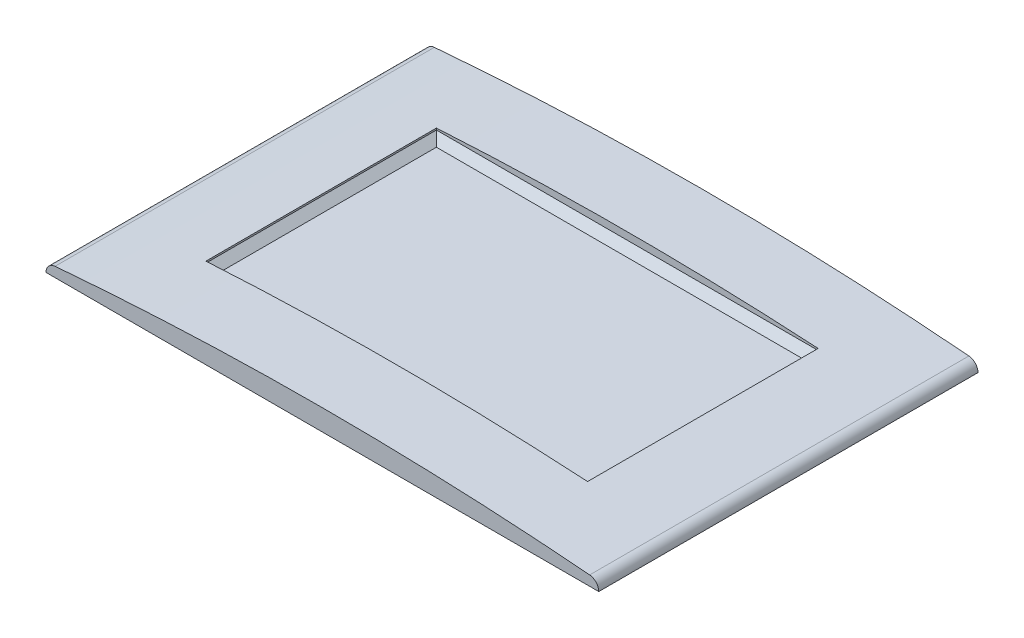
ISO-10303-21;
HEADER;
FILE_DESCRIPTION(('STEP AP214'),'2;1');
FILE_NAME('part.step','',(''),(''),'','','');
FILE_SCHEMA(('AUTOMOTIVE_DESIGN { 1 0 10303 214 1 1 1 1 }'));
ENDSEC;
DATA;
#1=APPLICATION_CONTEXT('core data for automotive mechanical design processes');
#2=APPLICATION_PROTOCOL_DEFINITION('international standard','automotive_design',2000,#1);
#3=PRODUCT_CONTEXT('',#1,'mechanical');
#4=PRODUCT('Part','Part','',(#3));
#5=PRODUCT_RELATED_PRODUCT_CATEGORY('part','',(#4));
#6=PRODUCT_DEFINITION_FORMATION('','',#4);
#7=PRODUCT_DEFINITION_CONTEXT('part definition',#1,'design');
#8=PRODUCT_DEFINITION('design','',#6,#7);
#9=PRODUCT_DEFINITION_SHAPE('','',#8);
#10=(LENGTH_UNIT() NAMED_UNIT(*) SI_UNIT(.MILLI.,.METRE.));
#11=(NAMED_UNIT(*) PLANE_ANGLE_UNIT() SI_UNIT($,.RADIAN.));
#12=(NAMED_UNIT(*) SI_UNIT($,.STERADIAN.) SOLID_ANGLE_UNIT());
#13=UNCERTAINTY_MEASURE_WITH_UNIT(LENGTH_MEASURE(1.E-05),#10,'distance_accuracy_value','');
#14=(GEOMETRIC_REPRESENTATION_CONTEXT(3) GLOBAL_UNCERTAINTY_ASSIGNED_CONTEXT((#13)) GLOBAL_UNIT_ASSIGNED_CONTEXT((#10,
#11,#12)) REPRESENTATION_CONTEXT('',''));
#15=CARTESIAN_POINT('',(0.,0.,0.));
#16=DIRECTION('',(0.,0.,1.));
#17=DIRECTION('',(1.,0.,0.));
#18=AXIS2_PLACEMENT_3D('',#15,#16,#17);
#19=CARTESIAN_POINT('',(-111.5,8.5,-76.5));
#20=DIRECTION('',(0.,0.,1.));
#21=DIRECTION('',(1.,0.,0.));
#22=AXIS2_PLACEMENT_3D('',#19,#20,#21);
#23=PLANE('',#22);
#24=CARTESIAN_POINT('',(0.,-1281.77777777778,-76.5));
#25=DIRECTION('',(0.,0.,1.));
#26=DIRECTION('',(1.,0.,0.));
#27=AXIS2_PLACEMENT_3D('',#24,#25,#26);
#28=CIRCLE('',#27,1290.27777777778);
#29=CARTESIAN_POINT('',(107.834297931154,3.98600613311374,-76.5));
#30=VERTEX_POINT('',#29);
#31=CARTESIAN_POINT('',(-107.834297931154,3.98600613311362,-76.5));
#32=VERTEX_POINT('',#31);
#33=EDGE_CURVE('E180',#30,#32,#28,.T.);
#34=ORIENTED_EDGE('',*,*,#33,.F.);
#35=CARTESIAN_POINT('',(107.5,-7.12971348626468E-13,-76.5));
#36=DIRECTION('',(0.,0.,1.));
#37=DIRECTION('',(1.,0.,0.));
#38=AXIS2_PLACEMENT_3D('',#35,#36,#37);
#39=CIRCLE('',#38,3.99999999999995);
#40=CARTESIAN_POINT('',(111.5,-7.12971348626468E-13,-76.5));
#41=VERTEX_POINT('',#40);
#42=EDGE_CURVE('E165',#41,#30,#39,.T.);
#43=ORIENTED_EDGE('',*,*,#42,.F.);
#44=DIRECTION('',(-1.,0.,0.));
#45=VECTOR('',#44,1.);
#46=CARTESIAN_POINT('',(-111.5,0.,-76.5));
#47=LINE('',#46,#45);
#48=CARTESIAN_POINT('',(-111.5,0.,-76.5));
#49=VERTEX_POINT('',#48);
#50=EDGE_CURVE('E173',#41,#49,#47,.T.);
#51=ORIENTED_EDGE('',*,*,#50,.T.);
#52=CARTESIAN_POINT('',(-107.5,0.,-76.5));
#53=DIRECTION('',(0.,0.,1.));
#54=DIRECTION('',(1.,0.,0.));
#55=AXIS2_PLACEMENT_3D('',#52,#53,#54);
#56=CIRCLE('',#55,3.99999999999968);
#57=EDGE_CURVE('E236',#49,#32,#56,.F.);
#58=ORIENTED_EDGE('',*,*,#57,.T.);
#59=EDGE_LOOP('',(#34,#43,#51,#58));
#60=FACE_BOUND('',#59,.T.);
#61=ADVANCED_FACE('F84',(#60),#23,.F.);
#62=CARTESIAN_POINT('',(-111.5,8.5,76.5));
#63=DIRECTION('',(0.,0.,-1.));
#64=DIRECTION('',(-1.,0.,0.));
#65=AXIS2_PLACEMENT_3D('',#62,#63,#64);
#66=PLANE('',#65);
#67=DIRECTION('',(1.,0.,0.));
#68=VECTOR('',#67,1.);
#69=CARTESIAN_POINT('',(-111.5,0.,76.5));
#70=LINE('',#69,#68);
#71=CARTESIAN_POINT('',(-111.5,0.,76.5));
#72=VERTEX_POINT('',#71);
#73=CARTESIAN_POINT('',(111.5,0.,76.5));
#74=VERTEX_POINT('',#73);
#75=EDGE_CURVE('E187',#72,#74,#70,.T.);
#76=ORIENTED_EDGE('',*,*,#75,.T.);
#77=CARTESIAN_POINT('',(107.5,-7.12971348626468E-13,76.5));
#78=DIRECTION('',(0.,0.,-1.));
#79=DIRECTION('',(-1.,0.,0.));
#80=AXIS2_PLACEMENT_3D('',#77,#78,#79);
#81=CIRCLE('',#80,3.99999999999995);
#82=CARTESIAN_POINT('',(107.834297931154,3.98600613311374,76.5));
#83=VERTEX_POINT('',#82);
#84=EDGE_CURVE('E168',#74,#83,#81,.F.);
#85=ORIENTED_EDGE('',*,*,#84,.T.);
#86=CARTESIAN_POINT('',(0.,-1281.77777777778,76.5));
#87=DIRECTION('',(0.,0.,-1.));
#88=DIRECTION('',(-1.,0.,0.));
#89=AXIS2_PLACEMENT_3D('',#86,#87,#88);
#90=CIRCLE('',#89,1290.27777777778);
#91=CARTESIAN_POINT('',(-107.834297931154,3.98600613311362,76.5));
#92=VERTEX_POINT('',#91);
#93=EDGE_CURVE('E230',#83,#92,#90,.F.);
#94=ORIENTED_EDGE('',*,*,#93,.T.);
#95=CARTESIAN_POINT('',(-107.5,0.,76.5));
#96=DIRECTION('',(0.,0.,-1.));
#97=DIRECTION('',(-1.,0.,0.));
#98=AXIS2_PLACEMENT_3D('',#95,#96,#97);
#99=CIRCLE('',#98,3.99999999999968);
#100=EDGE_CURVE('E232',#72,#92,#99,.T.);
#101=ORIENTED_EDGE('',*,*,#100,.F.);
#102=EDGE_LOOP('',(#76,#85,#94,#101));
#103=FACE_BOUND('',#102,.T.);
#104=ADVANCED_FACE('F282',(#103),#66,.F.);
#105=CARTESIAN_POINT('',(111.5,0.,-76.5));
#106=DIRECTION('',(0.,-1.,0.));
#107=DIRECTION('',(0.,0.,-1.));
#108=AXIS2_PLACEMENT_3D('',#105,#106,#107);
#109=PLANE('',#108);
#110=DIRECTION('',(0.,0.,-1.));
#111=VECTOR('',#110,1.);
#112=CARTESIAN_POINT('',(111.5,0.,76.5));
#113=LINE('',#112,#111);
#114=EDGE_CURVE('E161',#74,#41,#113,.T.);
#115=ORIENTED_EDGE('',*,*,#114,.F.);
#116=ORIENTED_EDGE('',*,*,#75,.F.);
#117=DIRECTION('',(0.,0.,1.));
#118=VECTOR('',#117,1.);
#119=CARTESIAN_POINT('',(-111.5,0.,76.5));
#120=LINE('',#119,#118);
#121=EDGE_CURVE('E185',#49,#72,#120,.T.);
#122=ORIENTED_EDGE('',*,*,#121,.F.);
#123=ORIENTED_EDGE('',*,*,#50,.F.);
#124=EDGE_LOOP('',(#115,#116,#122,#123));
#125=FACE_BOUND('',#124,.T.);
#126=ADVANCED_FACE('F184',(#125),#109,.T.);
#127=CARTESIAN_POINT('',(77.,2.5,-46.5));
#128=DIRECTION('',(1.,0.,0.));
#129=DIRECTION('',(0.,0.,-1.));
#130=AXIS2_PLACEMENT_3D('',#127,#128,#129);
#131=PLANE('',#130);
#132=DIRECTION('',(0.,1.,0.));
#133=VECTOR('',#132,1.);
#134=CARTESIAN_POINT('',(77.,2.5,-46.5));
#135=LINE('',#134,#133);
#136=CARTESIAN_POINT('',(77.,5.49999999999995,-46.5));
#137=VERTEX_POINT('',#136);
#138=CARTESIAN_POINT('',(77.,6.20038346066432,-46.5));
#139=VERTEX_POINT('',#138);
#140=EDGE_CURVE('E246',#137,#139,#135,.T.);
#141=ORIENTED_EDGE('',*,*,#140,.F.);
#142=DIRECTION('',(0.,0.,1.));
#143=VECTOR('',#142,1.);
#144=CARTESIAN_POINT('',(77.,5.49999999999995,-46.5));
#145=LINE('',#144,#143);
#146=CARTESIAN_POINT('',(77.,5.49999999999995,46.5));
#147=VERTEX_POINT('',#146);
#148=EDGE_CURVE('E207',#137,#147,#145,.T.);
#149=ORIENTED_EDGE('',*,*,#148,.T.);
#150=DIRECTION('',(0.,1.,0.));
#151=VECTOR('',#150,1.);
#152=CARTESIAN_POINT('',(77.,2.5,46.5));
#153=LINE('',#152,#151);
#154=CARTESIAN_POINT('',(77.,6.20038346066432,46.5));
#155=VERTEX_POINT('',#154);
#156=EDGE_CURVE('E174',#147,#155,#153,.T.);
#157=ORIENTED_EDGE('',*,*,#156,.T.);
#158=DIRECTION('',(0.,0.,1.));
#159=VECTOR('',#158,1.);
#160=CARTESIAN_POINT('',(77.,6.20038346066432,-188.323521675898));
#161=LINE('',#160,#159);
#162=EDGE_CURVE('E181',#155,#139,#161,.F.);
#163=ORIENTED_EDGE('',*,*,#162,.T.);
#164=EDGE_LOOP('',(#141,#149,#157,#163));
#165=FACE_BOUND('',#164,.T.);
#166=ADVANCED_FACE('F260',(#165),#131,.F.);
#167=CARTESIAN_POINT('',(-77.,2.5,46.5));
#168=DIRECTION('',(0.,0.,1.));
#169=DIRECTION('',(1.,0.,0.));
#170=AXIS2_PLACEMENT_3D('',#167,#168,#169);
#171=PLANE('',#170);
#172=ORIENTED_EDGE('',*,*,#156,.F.);
#173=DIRECTION('',(-1.,0.,0.));
#174=VECTOR('',#173,1.);
#175=CARTESIAN_POINT('',(-77.,5.49999999999995,46.5));
#176=LINE('',#175,#174);
#177=CARTESIAN_POINT('',(-77.,5.49999999999995,46.5));
#178=VERTEX_POINT('',#177);
#179=EDGE_CURVE('E204',#147,#178,#176,.T.);
#180=ORIENTED_EDGE('',*,*,#179,.T.);
#181=DIRECTION('',(0.,1.,0.));
#182=VECTOR('',#181,1.);
#183=CARTESIAN_POINT('',(-77.,2.5,46.5));
#184=LINE('',#183,#182);
#185=CARTESIAN_POINT('',(-77.,6.20038346066432,46.5));
#186=VERTEX_POINT('',#185);
#187=EDGE_CURVE('E248',#178,#186,#184,.T.);
#188=ORIENTED_EDGE('',*,*,#187,.T.);
#189=CARTESIAN_POINT('',(0.,-1281.77777777778,46.5));
#190=DIRECTION('',(0.,0.,1.));
#191=DIRECTION('',(1.,0.,0.));
#192=AXIS2_PLACEMENT_3D('',#189,#190,#191);
#193=CIRCLE('',#192,1290.27777777778);
#194=EDGE_CURVE('E243',#186,#155,#193,.F.);
#195=ORIENTED_EDGE('',*,*,#194,.T.);
#196=EDGE_LOOP('',(#172,#180,#188,#195));
#197=FACE_BOUND('',#196,.T.);
#198=ADVANCED_FACE('F264',(#197),#171,.F.);
#199=CARTESIAN_POINT('',(-77.,2.5,-46.5));
#200=DIRECTION('',(-1.,0.,0.));
#201=DIRECTION('',(0.,0.,1.));
#202=AXIS2_PLACEMENT_3D('',#199,#200,#201);
#203=PLANE('',#202);
#204=ORIENTED_EDGE('',*,*,#187,.F.);
#205=DIRECTION('',(0.,0.,-1.));
#206=VECTOR('',#205,1.);
#207=CARTESIAN_POINT('',(-77.,5.49999999999995,-46.5));
#208=LINE('',#207,#206);
#209=CARTESIAN_POINT('',(-77.,5.49999999999995,-46.5));
#210=VERTEX_POINT('',#209);
#211=EDGE_CURVE('E93',#178,#210,#208,.T.);
#212=ORIENTED_EDGE('',*,*,#211,.T.);
#213=DIRECTION('',(0.,1.,0.));
#214=VECTOR('',#213,1.);
#215=CARTESIAN_POINT('',(-77.,2.5,-46.5));
#216=LINE('',#215,#214);
#217=CARTESIAN_POINT('',(-77.,6.20038346066432,-46.5));
#218=VERTEX_POINT('',#217);
#219=EDGE_CURVE('E250',#210,#218,#216,.T.);
#220=ORIENTED_EDGE('',*,*,#219,.T.);
#221=DIRECTION('',(0.,0.,1.));
#222=VECTOR('',#221,1.);
#223=CARTESIAN_POINT('',(-77.,6.20038346066432,-188.323521675898));
#224=LINE('',#223,#222);
#225=EDGE_CURVE('E240',#218,#186,#224,.T.);
#226=ORIENTED_EDGE('',*,*,#225,.T.);
#227=EDGE_LOOP('',(#204,#212,#220,#226));
#228=FACE_BOUND('',#227,.T.);
#229=ADVANCED_FACE('F265',(#228),#203,.F.);
#230=CARTESIAN_POINT('',(-77.,2.5,-46.5));
#231=DIRECTION('',(0.,0.,-1.));
#232=DIRECTION('',(-1.,0.,0.));
#233=AXIS2_PLACEMENT_3D('',#230,#231,#232);
#234=PLANE('',#233);
#235=ORIENTED_EDGE('',*,*,#219,.F.);
#236=DIRECTION('',(1.,0.,0.));
#237=VECTOR('',#236,1.);
#238=CARTESIAN_POINT('',(-77.,5.49999999999995,-46.5));
#239=LINE('',#238,#237);
#240=EDGE_CURVE('E12',#210,#137,#239,.T.);
#241=ORIENTED_EDGE('',*,*,#240,.T.);
#242=ORIENTED_EDGE('',*,*,#140,.T.);
#243=CARTESIAN_POINT('',(0.,-1281.77777777778,-46.5));
#244=DIRECTION('',(0.,0.,-1.));
#245=DIRECTION('',(-1.,0.,0.));
#246=AXIS2_PLACEMENT_3D('',#243,#244,#245);
#247=CIRCLE('',#246,1290.27777777778);
#248=EDGE_CURVE('E192',#139,#218,#247,.F.);
#249=ORIENTED_EDGE('',*,*,#248,.T.);
#250=EDGE_LOOP('',(#235,#241,#242,#249));
#251=FACE_BOUND('',#250,.T.);
#252=ADVANCED_FACE('F252',(#251),#234,.F.);
#253=CARTESIAN_POINT('',(76.9999999999999,2.5,46.5));
#254=DIRECTION('',(0.,1.,0.));
#255=DIRECTION('',(0.,0.,1.));
#256=AXIS2_PLACEMENT_3D('',#253,#254,#255);
#257=PLANE('',#256);
#258=DIRECTION('',(0.,0.,1.));
#259=VECTOR('',#258,1.);
#260=CARTESIAN_POINT('',(-74.,2.5,46.5));
#261=LINE('',#260,#259);
#262=CARTESIAN_POINT('',(-74.,2.5,-43.5));
#263=VERTEX_POINT('',#262);
#264=CARTESIAN_POINT('',(-74.,2.5,43.5));
#265=VERTEX_POINT('',#264);
#266=EDGE_CURVE('E197',#263,#265,#261,.T.);
#267=ORIENTED_EDGE('',*,*,#266,.T.);
#268=DIRECTION('',(1.,0.,0.));
#269=VECTOR('',#268,1.);
#270=CARTESIAN_POINT('',(76.9999999999999,2.5,43.5));
#271=LINE('',#270,#269);
#272=CARTESIAN_POINT('',(74.,2.5,43.5));
#273=VERTEX_POINT('',#272);
#274=EDGE_CURVE('E201',#265,#273,#271,.T.);
#275=ORIENTED_EDGE('',*,*,#274,.T.);
#276=DIRECTION('',(0.,0.,-1.));
#277=VECTOR('',#276,1.);
#278=CARTESIAN_POINT('',(74.,2.5,46.5));
#279=LINE('',#278,#277);
#280=CARTESIAN_POINT('',(74.,2.5,-43.5));
#281=VERTEX_POINT('',#280);
#282=EDGE_CURVE('E199',#273,#281,#279,.T.);
#283=ORIENTED_EDGE('',*,*,#282,.T.);
#284=DIRECTION('',(-1.,0.,0.));
#285=VECTOR('',#284,1.);
#286=CARTESIAN_POINT('',(76.9999999999999,2.5,-43.5));
#287=LINE('',#286,#285);
#288=EDGE_CURVE('E195',#281,#263,#287,.T.);
#289=ORIENTED_EDGE('',*,*,#288,.T.);
#290=EDGE_LOOP('',(#267,#275,#283,#289));
#291=FACE_BOUND('',#290,.T.);
#292=ADVANCED_FACE('F311',(#291),#257,.T.);
#293=CARTESIAN_POINT('',(0.,-1281.77777777778,-188.323521675898));
#294=DIRECTION('',(0.,0.,1.));
#295=DIRECTION('',(1.,0.,0.));
#296=AXIS2_PLACEMENT_3D('',#293,#294,#295);
#297=CYLINDRICAL_SURFACE('',#296,1290.27777777778);
#298=ORIENTED_EDGE('',*,*,#248,.F.);
#299=ORIENTED_EDGE('',*,*,#162,.F.);
#300=ORIENTED_EDGE('',*,*,#194,.F.);
#301=ORIENTED_EDGE('',*,*,#225,.F.);
#302=EDGE_LOOP('',(#298,#299,#300,#301));
#303=FACE_BOUND('',#302,.T.);
#304=DIRECTION('',(0.,0.,1.));
#305=VECTOR('',#304,1.);
#306=CARTESIAN_POINT('',(107.834297931154,3.98600613311374,-188.323521675898));
#307=LINE('',#306,#305);
#308=EDGE_CURVE('E182',#30,#83,#307,.T.);
#309=ORIENTED_EDGE('',*,*,#308,.F.);
#310=ORIENTED_EDGE('',*,*,#33,.T.);
#311=DIRECTION('',(0.,0.,1.));
#312=VECTOR('',#311,1.);
#313=CARTESIAN_POINT('',(-107.834297931154,3.98600613311418,-188.323521675898));
#314=LINE('',#313,#312);
#315=EDGE_CURVE('E235',#32,#92,#314,.T.);
#316=ORIENTED_EDGE('',*,*,#315,.T.);
#317=ORIENTED_EDGE('',*,*,#93,.F.);
#318=EDGE_LOOP('',(#309,#310,#316,#317));
#319=FACE_BOUND('',#318,.T.);
#320=ADVANCED_FACE('F257',(#303,#319),#297,.T.);
#321=CARTESIAN_POINT('',(-107.5,0.,-188.323521675898));
#322=DIRECTION('',(0.,0.,1.));
#323=DIRECTION('',(1.,0.,0.));
#324=AXIS2_PLACEMENT_3D('',#321,#322,#323);
#325=CYLINDRICAL_SURFACE('',#324,3.99999999999968);
#326=ORIENTED_EDGE('',*,*,#121,.T.);
#327=ORIENTED_EDGE('',*,*,#100,.T.);
#328=ORIENTED_EDGE('',*,*,#315,.F.);
#329=ORIENTED_EDGE('',*,*,#57,.F.);
#330=EDGE_LOOP('',(#326,#327,#328,#329));
#331=FACE_BOUND('',#330,.T.);
#332=ADVANCED_FACE('F331',(#331),#325,.T.);
#333=CARTESIAN_POINT('',(107.5,-7.12971348626468E-13,-188.323521675898));
#334=DIRECTION('',(0.,0.,1.));
#335=DIRECTION('',(1.,0.,0.));
#336=AXIS2_PLACEMENT_3D('',#333,#334,#335);
#337=CYLINDRICAL_SURFACE('',#336,3.99999999999995);
#338=ORIENTED_EDGE('',*,*,#42,.T.);
#339=ORIENTED_EDGE('',*,*,#308,.T.);
#340=ORIENTED_EDGE('',*,*,#84,.F.);
#341=ORIENTED_EDGE('',*,*,#114,.T.);
#342=EDGE_LOOP('',(#338,#339,#340,#341));
#343=FACE_BOUND('',#342,.T.);
#344=ADVANCED_FACE('F163',(#343),#337,.T.);
#345=CARTESIAN_POINT('',(76.9999999999999,2.5,-43.5));
#346=DIRECTION('',(0.,-0.707106781186554,-0.707106781186541));
#347=DIRECTION('',(0.,0.707106781186541,-0.707106781186554));
#348=AXIS2_PLACEMENT_3D('',#345,#346,#347);
#349=PLANE('',#348);
#350=DIRECTION('',(0.577350269189629,0.577350269189619,-0.577350269189629));
#351=VECTOR('',#350,1.);
#352=CARTESIAN_POINT('',(43.9999999999996,-27.4999999999998,-13.4999999999996));
#353=LINE('',#352,#351);
#354=EDGE_CURVE('E213',#137,#281,#353,.F.);
#355=ORIENTED_EDGE('',*,*,#354,.F.);
#356=ORIENTED_EDGE('',*,*,#240,.F.);
#357=DIRECTION('',(0.577350269189629,-0.577350269189619,0.577350269189629));
#358=VECTOR('',#357,1.);
#359=CARTESIAN_POINT('',(-43.9999999999996,-27.4999999999998,-13.4999999999996));
#360=LINE('',#359,#358);
#361=EDGE_CURVE('E88',#263,#210,#360,.F.);
#362=ORIENTED_EDGE('',*,*,#361,.F.);
#363=ORIENTED_EDGE('',*,*,#288,.F.);
#364=EDGE_LOOP('',(#355,#356,#362,#363));
#365=FACE_BOUND('',#364,.T.);
#366=ADVANCED_FACE('F86',(#365),#349,.F.);
#367=CARTESIAN_POINT('',(-74.,2.5,46.5));
#368=DIRECTION('',(-0.707106781186541,-0.707106781186554,0.));
#369=DIRECTION('',(0.707106781186554,-0.707106781186541,0.));
#370=AXIS2_PLACEMENT_3D('',#367,#368,#369);
#371=PLANE('',#370);
#372=ORIENTED_EDGE('',*,*,#361,.T.);
#373=ORIENTED_EDGE('',*,*,#211,.F.);
#374=DIRECTION('',(0.577350269189629,-0.577350269189619,-0.577350269189629));
#375=VECTOR('',#374,1.);
#376=CARTESIAN_POINT('',(-23.6666666666661,-47.833333333333,-6.83333333333393));
#377=LINE('',#376,#375);
#378=EDGE_CURVE('E212',#265,#178,#377,.F.);
#379=ORIENTED_EDGE('',*,*,#378,.F.);
#380=ORIENTED_EDGE('',*,*,#266,.F.);
#381=EDGE_LOOP('',(#372,#373,#379,#380));
#382=FACE_BOUND('',#381,.T.);
#383=ADVANCED_FACE('F274',(#382),#371,.F.);
#384=CARTESIAN_POINT('',(74.,2.5,46.5));
#385=DIRECTION('',(0.707106781186541,-0.707106781186554,0.));
#386=DIRECTION('',(0.707106781186554,0.707106781186541,0.));
#387=AXIS2_PLACEMENT_3D('',#384,#385,#386);
#388=PLANE('',#387);
#389=ORIENTED_EDGE('',*,*,#354,.T.);
#390=ORIENTED_EDGE('',*,*,#282,.F.);
#391=DIRECTION('',(0.577350269189629,0.577350269189619,0.577350269189629));
#392=VECTOR('',#391,1.);
#393=CARTESIAN_POINT('',(75.,3.49999999999997,44.5));
#394=LINE('',#393,#392);
#395=EDGE_CURVE('E210',#147,#273,#394,.F.);
#396=ORIENTED_EDGE('',*,*,#395,.F.);
#397=ORIENTED_EDGE('',*,*,#148,.F.);
#398=EDGE_LOOP('',(#389,#390,#396,#397));
#399=FACE_BOUND('',#398,.T.);
#400=ADVANCED_FACE('F269',(#399),#388,.F.);
#401=CARTESIAN_POINT('',(76.9999999999999,2.5,43.5));
#402=DIRECTION('',(0.,-0.707106781186554,0.707106781186541));
#403=DIRECTION('',(0.,-0.707106781186541,-0.707106781186554));
#404=AXIS2_PLACEMENT_3D('',#401,#402,#403);
#405=PLANE('',#404);
#406=ORIENTED_EDGE('',*,*,#378,.T.);
#407=ORIENTED_EDGE('',*,*,#179,.F.);
#408=ORIENTED_EDGE('',*,*,#395,.T.);
#409=ORIENTED_EDGE('',*,*,#274,.F.);
#410=EDGE_LOOP('',(#406,#407,#408,#409));
#411=FACE_BOUND('',#410,.T.);
#412=ADVANCED_FACE('F272',(#411),#405,.F.);
#413=CLOSED_SHELL('',(#61,#104,#126,#166,#198,#229,#252,#292,#320,#332,#344,#366,#383,#400,#412));
#414=MANIFOLD_SOLID_BREP('B2',#413);
#415=ADVANCED_BREP_SHAPE_REPRESENTATION('',(#18,#414),#14);
#416=SHAPE_DEFINITION_REPRESENTATION(#9,#415);
ENDSEC;
END-ISO-10303-21;
